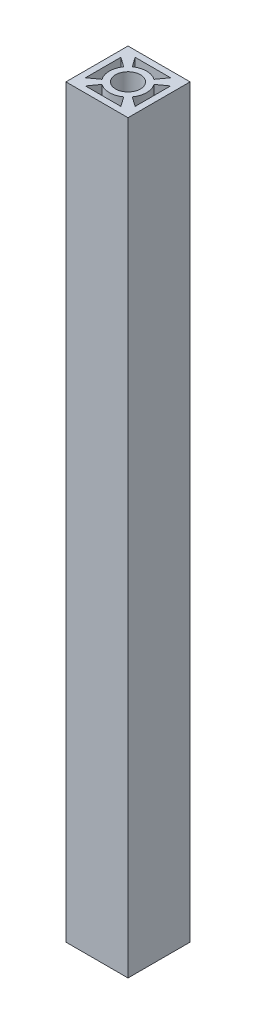
ISO-10303-21;
HEADER;
FILE_DESCRIPTION(('STEP AP214'),'2;1');
FILE_NAME('part.step','',(''),(''),'','','');
FILE_SCHEMA(('AUTOMOTIVE_DESIGN { 1 0 10303 214 1 1 1 1 }'));
ENDSEC;
DATA;
#1=APPLICATION_CONTEXT('core data for automotive mechanical design processes');
#2=APPLICATION_PROTOCOL_DEFINITION('international standard','automotive_design',2000,#1);
#3=PRODUCT_CONTEXT('',#1,'mechanical');
#4=PRODUCT('Part','Part','',(#3));
#5=PRODUCT_RELATED_PRODUCT_CATEGORY('part','',(#4));
#6=PRODUCT_DEFINITION_FORMATION('','',#4);
#7=PRODUCT_DEFINITION_CONTEXT('part definition',#1,'design');
#8=PRODUCT_DEFINITION('design','',#6,#7);
#9=PRODUCT_DEFINITION_SHAPE('','',#8);
#10=(LENGTH_UNIT() NAMED_UNIT(*) SI_UNIT(.MILLI.,.METRE.));
#11=(NAMED_UNIT(*) PLANE_ANGLE_UNIT() SI_UNIT($,.RADIAN.));
#12=(NAMED_UNIT(*) SI_UNIT($,.STERADIAN.) SOLID_ANGLE_UNIT());
#13=UNCERTAINTY_MEASURE_WITH_UNIT(LENGTH_MEASURE(1.E-05),#10,'distance_accuracy_value','');
#14=(GEOMETRIC_REPRESENTATION_CONTEXT(3) GLOBAL_UNCERTAINTY_ASSIGNED_CONTEXT((#13)) GLOBAL_UNIT_ASSIGNED_CONTEXT((#10,
#11,#12)) REPRESENTATION_CONTEXT('',''));
#15=CARTESIAN_POINT('',(0.,0.,0.));
#16=DIRECTION('',(0.,0.,1.));
#17=DIRECTION('',(1.,0.,0.));
#18=AXIS2_PLACEMENT_3D('',#15,#16,#17);
#19=CARTESIAN_POINT('',(49.9999999999999,600.,100.));
#20=DIRECTION('',(-1.,0.,0.));
#21=DIRECTION('',(0.,-1.,0.));
#22=AXIS2_PLACEMENT_3D('',#19,#20,#21);
#23=PLANE('',#22);
#24=DIRECTION('',(0.,1.,0.));
#25=VECTOR('',#24,1.);
#26=CARTESIAN_POINT('',(49.9999999999999,600.,0.));
#27=LINE('',#26,#25);
#28=CARTESIAN_POINT('',(50.0000000000001,-600.,0.));
#29=VERTEX_POINT('',#28);
#30=CARTESIAN_POINT('',(49.9999999999999,600.,0.));
#31=VERTEX_POINT('',#30);
#32=EDGE_CURVE('E303',#29,#31,#27,.T.);
#33=ORIENTED_EDGE('',*,*,#32,.T.);
#34=DIRECTION('',(0.,0.,-1.));
#35=VECTOR('',#34,1.);
#36=CARTESIAN_POINT('',(49.9999999999999,600.,100.));
#37=LINE('',#36,#35);
#38=CARTESIAN_POINT('',(49.9999999999999,600.,100.));
#39=VERTEX_POINT('',#38);
#40=EDGE_CURVE('E11',#39,#31,#37,.T.);
#41=ORIENTED_EDGE('',*,*,#40,.F.);
#42=DIRECTION('',(0.,1.,0.));
#43=VECTOR('',#42,1.);
#44=CARTESIAN_POINT('',(49.9999999999999,600.,100.));
#45=LINE('',#44,#43);
#46=CARTESIAN_POINT('',(50.0000000000001,-600.,100.));
#47=VERTEX_POINT('',#46);
#48=EDGE_CURVE('E310',#47,#39,#45,.T.);
#49=ORIENTED_EDGE('',*,*,#48,.F.);
#50=DIRECTION('',(0.,0.,-1.));
#51=VECTOR('',#50,1.);
#52=CARTESIAN_POINT('',(50.0000000000001,-600.,100.));
#53=LINE('',#52,#51);
#54=EDGE_CURVE('E320',#47,#29,#53,.T.);
#55=ORIENTED_EDGE('',*,*,#54,.T.);
#56=EDGE_LOOP('',(#33,#41,#49,#55));
#57=FACE_BOUND('',#56,.T.);
#58=ADVANCED_FACE('F35',(#57),#23,.F.);
#59=CARTESIAN_POINT('',(-50.0000000000001,600.,100.));
#60=DIRECTION('',(0.,-1.,0.));
#61=DIRECTION('',(0.,0.,-1.));
#62=AXIS2_PLACEMENT_3D('',#59,#60,#61);
#63=PLANE('',#62);
#64=DIRECTION('',(-0.58127467016539,0.,0.813707415367537));
#65=VECTOR('',#64,1.);
#66=CARTESIAN_POINT('',(-28.5741365600266,600.,89.9999999999997));
#67=LINE('',#66,#65);
#68=CARTESIAN_POINT('',(-17.438240104964,600.,74.4112224610246));
#69=VERTEX_POINT('',#68);
#70=CARTESIAN_POINT('',(-28.5741365600266,600.,89.9999999999997));
#71=VERTEX_POINT('',#70);
#72=EDGE_CURVE('E198',#69,#71,#67,.T.);
#73=ORIENTED_EDGE('',*,*,#72,.F.);
#74=CARTESIAN_POINT('',(0.,600.,50.));
#75=DIRECTION('',(0.,-1.,0.));
#76=DIRECTION('',(0.,0.,1.));
#77=AXIS2_PLACEMENT_3D('',#74,#75,#76);
#78=CIRCLE('',#77,29.9999999999984);
#79=CARTESIAN_POINT('',(17.438240104957,600.,74.4112224610255));
#80=VERTEX_POINT('',#79);
#81=EDGE_CURVE('E49',#80,#69,#78,.T.);
#82=ORIENTED_EDGE('',*,*,#81,.F.);
#83=DIRECTION('',(-0.581274670165418,0.,-0.813707415367517));
#84=VECTOR('',#83,1.);
#85=CARTESIAN_POINT('',(17.438240104957,600.,74.4112224610255));
#86=LINE('',#85,#84);
#87=CARTESIAN_POINT('',(28.5741365600201,600.,90.0000000000004));
#88=VERTEX_POINT('',#87);
#89=EDGE_CURVE('E189',#88,#80,#86,.T.);
#90=ORIENTED_EDGE('',*,*,#89,.F.);
#91=DIRECTION('',(1.,0.,0.));
#92=VECTOR('',#91,1.);
#93=CARTESIAN_POINT('',(28.5741365600201,600.,90.0000000000004));
#94=LINE('',#93,#92);
#95=EDGE_CURVE('E192',#71,#88,#94,.T.);
#96=ORIENTED_EDGE('',*,*,#95,.F.);
#97=EDGE_LOOP('',(#73,#82,#90,#96));
#98=FACE_BOUND('',#97,.T.);
#99=DIRECTION('',(0.813707415367539,0.,0.581274670165387));
#100=VECTOR('',#99,1.);
#101=CARTESIAN_POINT('',(39.9999999999998,600.,78.5741365600263));
#102=LINE('',#101,#100);
#103=CARTESIAN_POINT('',(24.4112224610245,600.,67.4382401049639));
#104=VERTEX_POINT('',#103);
#105=CARTESIAN_POINT('',(39.9999999999998,600.,78.5741365600263));
#106=VERTEX_POINT('',#105);
#107=EDGE_CURVE('E223',#104,#106,#102,.T.);
#108=ORIENTED_EDGE('',*,*,#107,.F.);
#109=CARTESIAN_POINT('',(0.,600.,50.));
#110=DIRECTION('',(0.,-1.,0.));
#111=DIRECTION('',(0.,0.,1.));
#112=AXIS2_PLACEMENT_3D('',#109,#110,#111);
#113=CIRCLE('',#112,29.9999999999984);
#114=CARTESIAN_POINT('',(24.4112224610254,600.,32.5617598950428));
#115=VERTEX_POINT('',#114);
#116=EDGE_CURVE('E204',#115,#104,#113,.T.);
#117=ORIENTED_EDGE('',*,*,#116,.F.);
#118=DIRECTION('',(-0.813707415367515,0.,0.581274670165421));
#119=VECTOR('',#118,1.);
#120=CARTESIAN_POINT('',(24.4112224610254,600.,32.5617598950428));
#121=LINE('',#120,#119);
#122=CARTESIAN_POINT('',(40.0000000000002,600.,21.4258634399797));
#123=VERTEX_POINT('',#122);
#124=EDGE_CURVE('E212',#123,#115,#121,.T.);
#125=ORIENTED_EDGE('',*,*,#124,.F.);
#126=DIRECTION('',(0.,0.,-1.));
#127=VECTOR('',#126,1.);
#128=CARTESIAN_POINT('',(40.0000000000002,600.,21.4258634399797));
#129=LINE('',#128,#127);
#130=EDGE_CURVE('E226',#106,#123,#129,.T.);
#131=ORIENTED_EDGE('',*,*,#130,.F.);
#132=EDGE_LOOP('',(#108,#117,#125,#131));
#133=FACE_BOUND('',#132,.T.);
#134=DIRECTION('',(0.581274670165385,0.,-0.813707415367541));
#135=VECTOR('',#134,1.);
#136=CARTESIAN_POINT('',(28.5741365600261,600.,10.0000000000001));
#137=LINE('',#136,#135);
#138=CARTESIAN_POINT('',(17.4382401049637,600.,25.5887775389753));
#139=VERTEX_POINT('',#138);
#140=CARTESIAN_POINT('',(28.5741365600261,600.,10.0000000000001));
#141=VERTEX_POINT('',#140);
#142=EDGE_CURVE('E255',#139,#141,#137,.T.);
#143=ORIENTED_EDGE('',*,*,#142,.F.);
#144=CARTESIAN_POINT('',(0.,600.,50.));
#145=DIRECTION('',(0.,-1.,0.));
#146=DIRECTION('',(0.,0.,1.));
#147=AXIS2_PLACEMENT_3D('',#144,#145,#146);
#148=CIRCLE('',#147,29.9999999999984);
#149=CARTESIAN_POINT('',(-17.4382401049573,600.,25.5887775389746));
#150=VERTEX_POINT('',#149);
#151=EDGE_CURVE('E233',#150,#139,#148,.T.);
#152=ORIENTED_EDGE('',*,*,#151,.F.);
#153=DIRECTION('',(0.581274670165424,0.,0.813707415367513));
#154=VECTOR('',#153,1.);
#155=CARTESIAN_POINT('',(-17.4382401049573,600.,25.5887775389746));
#156=LINE('',#155,#154);
#157=CARTESIAN_POINT('',(-28.5741365600205,600.,9.99999999999986));
#158=VERTEX_POINT('',#157);
#159=EDGE_CURVE('E244',#158,#150,#156,.T.);
#160=ORIENTED_EDGE('',*,*,#159,.F.);
#161=DIRECTION('',(-1.,0.,0.));
#162=VECTOR('',#161,1.);
#163=CARTESIAN_POINT('',(-28.5741365600205,600.,9.99999999999986));
#164=LINE('',#163,#162);
#165=EDGE_CURVE('E258',#141,#158,#164,.T.);
#166=ORIENTED_EDGE('',*,*,#165,.F.);
#167=EDGE_LOOP('',(#143,#152,#160,#166));
#168=FACE_BOUND('',#167,.T.);
#169=CARTESIAN_POINT('',(0.,600.,50.));
#170=DIRECTION('',(0.,1.,0.));
#171=DIRECTION('',(0.,0.,1.));
#172=AXIS2_PLACEMENT_3D('',#169,#170,#171);
#173=CIRCLE('',#172,20.);
#174=CARTESIAN_POINT('',(0.,600.,70.));
#175=VERTEX_POINT('',#174);
#176=EDGE_CURVE('E265',#175,#175,#173,.T.);
#177=ORIENTED_EDGE('',*,*,#176,.F.);
#178=EDGE_LOOP('',(#177));
#179=FACE_BOUND('',#178,.T.);
#180=DIRECTION('',(-0.813707415367543,0.,-0.581274670165382));
#181=VECTOR('',#180,1.);
#182=CARTESIAN_POINT('',(-40.0000000000001,600.,21.4258634399739));
#183=LINE('',#182,#181);
#184=CARTESIAN_POINT('',(-24.4112224610248,600.,32.5617598950363));
#185=VERTEX_POINT('',#184);
#186=CARTESIAN_POINT('',(-40.0000000000001,600.,21.4258634399739));
#187=VERTEX_POINT('',#186);
#188=EDGE_CURVE('E293',#185,#187,#183,.T.);
#189=ORIENTED_EDGE('',*,*,#188,.F.);
#190=CARTESIAN_POINT('',(0.,600.,50.));
#191=DIRECTION('',(0.,-1.,0.));
#192=DIRECTION('',(0.,0.,1.));
#193=AXIS2_PLACEMENT_3D('',#190,#191,#192);
#194=CIRCLE('',#193,29.9999999999984);
#195=CARTESIAN_POINT('',(-24.4112224610254,600.,67.4382401049573));
#196=VERTEX_POINT('',#195);
#197=EDGE_CURVE('E275',#196,#185,#194,.T.);
#198=ORIENTED_EDGE('',*,*,#197,.F.);
#199=DIRECTION('',(0.813707415367511,0.,-0.581274670165427));
#200=VECTOR('',#199,1.);
#201=CARTESIAN_POINT('',(-24.4112224610254,600.,67.4382401049573));
#202=LINE('',#201,#200);
#203=CARTESIAN_POINT('',(-40.0000000000001,600.,78.5741365600206));
#204=VERTEX_POINT('',#203);
#205=EDGE_CURVE('E282',#204,#196,#202,.T.);
#206=ORIENTED_EDGE('',*,*,#205,.F.);
#207=DIRECTION('',(0.,0.,1.));
#208=VECTOR('',#207,1.);
#209=CARTESIAN_POINT('',(-40.0000000000001,600.,78.5741365600206));
#210=LINE('',#209,#208);
#211=EDGE_CURVE('E296',#187,#204,#210,.T.);
#212=ORIENTED_EDGE('',*,*,#211,.F.);
#213=EDGE_LOOP('',(#189,#198,#206,#212));
#214=FACE_BOUND('',#213,.T.);
#215=DIRECTION('',(-1.,0.,0.));
#216=VECTOR('',#215,1.);
#217=CARTESIAN_POINT('',(-50.0000000000001,600.,0.));
#218=LINE('',#217,#216);
#219=CARTESIAN_POINT('',(-50.0000000000001,600.,0.));
#220=VERTEX_POINT('',#219);
#221=EDGE_CURVE('E323',#31,#220,#218,.T.);
#222=ORIENTED_EDGE('',*,*,#221,.T.);
#223=DIRECTION('',(0.,0.,-1.));
#224=VECTOR('',#223,1.);
#225=CARTESIAN_POINT('',(-50.0000000000001,600.,100.));
#226=LINE('',#225,#224);
#227=CARTESIAN_POINT('',(-50.0000000000001,600.,100.));
#228=VERTEX_POINT('',#227);
#229=EDGE_CURVE('E42',#228,#220,#226,.T.);
#230=ORIENTED_EDGE('',*,*,#229,.F.);
#231=DIRECTION('',(-1.,0.,0.));
#232=VECTOR('',#231,1.);
#233=CARTESIAN_POINT('',(-50.0000000000001,600.,100.));
#234=LINE('',#233,#232);
#235=EDGE_CURVE('E313',#39,#228,#234,.T.);
#236=ORIENTED_EDGE('',*,*,#235,.F.);
#237=ORIENTED_EDGE('',*,*,#40,.T.);
#238=EDGE_LOOP('',(#222,#230,#236,#237));
#239=FACE_BOUND('',#238,.T.);
#240=ADVANCED_FACE('F352',(#98,#133,#168,#179,#214,#239),#63,.F.);
#241=CARTESIAN_POINT('',(-50.0000000000001,600.,100.));
#242=DIRECTION('',(1.,0.,0.));
#243=DIRECTION('',(0.,1.,0.));
#244=AXIS2_PLACEMENT_3D('',#241,#242,#243);
#245=PLANE('',#244);
#246=DIRECTION('',(0.,-1.,0.));
#247=VECTOR('',#246,1.);
#248=CARTESIAN_POINT('',(-50.0000000000001,600.,0.));
#249=LINE('',#248,#247);
#250=CARTESIAN_POINT('',(-49.9999999999999,-600.,0.));
#251=VERTEX_POINT('',#250);
#252=EDGE_CURVE('E325',#220,#251,#249,.T.);
#253=ORIENTED_EDGE('',*,*,#252,.T.);
#254=DIRECTION('',(0.,0.,-1.));
#255=VECTOR('',#254,1.);
#256=CARTESIAN_POINT('',(-49.9999999999999,-600.,100.));
#257=LINE('',#256,#255);
#258=CARTESIAN_POINT('',(-49.9999999999999,-600.,100.));
#259=VERTEX_POINT('',#258);
#260=EDGE_CURVE('E330',#259,#251,#257,.T.);
#261=ORIENTED_EDGE('',*,*,#260,.F.);
#262=DIRECTION('',(0.,-1.,0.));
#263=VECTOR('',#262,1.);
#264=CARTESIAN_POINT('',(-50.0000000000001,600.,100.));
#265=LINE('',#264,#263);
#266=EDGE_CURVE('E316',#228,#259,#265,.T.);
#267=ORIENTED_EDGE('',*,*,#266,.F.);
#268=ORIENTED_EDGE('',*,*,#229,.T.);
#269=EDGE_LOOP('',(#253,#261,#267,#268));
#270=FACE_BOUND('',#269,.T.);
#271=ADVANCED_FACE('F337',(#270),#245,.F.);
#272=CARTESIAN_POINT('',(-49.9999999999999,-600.,100.));
#273=DIRECTION('',(0.,1.,0.));
#274=DIRECTION('',(0.,0.,1.));
#275=AXIS2_PLACEMENT_3D('',#272,#273,#274);
#276=PLANE('',#275);
#277=DIRECTION('',(-0.581274670165418,0.,-0.813707415367517));
#278=VECTOR('',#277,1.);
#279=CARTESIAN_POINT('',(17.438240104957,-600.,74.4112224610255));
#280=LINE('',#279,#278);
#281=CARTESIAN_POINT('',(28.5741365600201,-600.,90.0000000000004));
#282=VERTEX_POINT('',#281);
#283=CARTESIAN_POINT('',(17.438240104957,-600.,74.4112224610255));
#284=VERTEX_POINT('',#283);
#285=EDGE_CURVE('E179',#282,#284,#280,.T.);
#286=ORIENTED_EDGE('',*,*,#285,.T.);
#287=CARTESIAN_POINT('',(0.,-600.,50.));
#288=DIRECTION('',(0.,-1.,0.));
#289=DIRECTION('',(0.,0.,1.));
#290=AXIS2_PLACEMENT_3D('',#287,#288,#289);
#291=CIRCLE('',#290,29.9999999999984);
#292=CARTESIAN_POINT('',(-17.438240104964,-600.,74.4112224610246));
#293=VERTEX_POINT('',#292);
#294=EDGE_CURVE('E173',#284,#293,#291,.T.);
#295=ORIENTED_EDGE('',*,*,#294,.T.);
#296=DIRECTION('',(-0.58127467016539,0.,0.813707415367537));
#297=VECTOR('',#296,1.);
#298=CARTESIAN_POINT('',(-28.5741365600266,-600.,89.9999999999997));
#299=LINE('',#298,#297);
#300=CARTESIAN_POINT('',(-28.5741365600266,-600.,89.9999999999997));
#301=VERTEX_POINT('',#300);
#302=EDGE_CURVE('E182',#293,#301,#299,.T.);
#303=ORIENTED_EDGE('',*,*,#302,.T.);
#304=DIRECTION('',(1.,0.,0.));
#305=VECTOR('',#304,1.);
#306=CARTESIAN_POINT('',(28.5741365600201,-600.,90.0000000000004));
#307=LINE('',#306,#305);
#308=EDGE_CURVE('E57',#301,#282,#307,.T.);
#309=ORIENTED_EDGE('',*,*,#308,.T.);
#310=EDGE_LOOP('',(#286,#295,#303,#309));
#311=FACE_BOUND('',#310,.T.);
#312=DIRECTION('',(-0.813707415367515,0.,0.581274670165421));
#313=VECTOR('',#312,1.);
#314=CARTESIAN_POINT('',(24.4112224610254,-600.,32.5617598950428));
#315=LINE('',#314,#313);
#316=CARTESIAN_POINT('',(40.0000000000002,-600.,21.4258634399797));
#317=VERTEX_POINT('',#316);
#318=CARTESIAN_POINT('',(24.4112224610254,-600.,32.5617598950428));
#319=VERTEX_POINT('',#318);
#320=EDGE_CURVE('E218',#317,#319,#315,.T.);
#321=ORIENTED_EDGE('',*,*,#320,.T.);
#322=CARTESIAN_POINT('',(0.,-600.,50.));
#323=DIRECTION('',(0.,-1.,0.));
#324=DIRECTION('',(0.,0.,1.));
#325=AXIS2_PLACEMENT_3D('',#322,#323,#324);
#326=CIRCLE('',#325,29.9999999999984);
#327=CARTESIAN_POINT('',(24.4112224610245,-600.,67.4382401049639));
#328=VERTEX_POINT('',#327);
#329=EDGE_CURVE('E208',#319,#328,#326,.T.);
#330=ORIENTED_EDGE('',*,*,#329,.T.);
#331=DIRECTION('',(0.813707415367539,0.,0.581274670165387));
#332=VECTOR('',#331,1.);
#333=CARTESIAN_POINT('',(39.9999999999998,-600.,78.5741365600263));
#334=LINE('',#333,#332);
#335=CARTESIAN_POINT('',(39.9999999999998,-600.,78.5741365600263));
#336=VERTEX_POINT('',#335);
#337=EDGE_CURVE('E211',#328,#336,#334,.T.);
#338=ORIENTED_EDGE('',*,*,#337,.T.);
#339=DIRECTION('',(0.,0.,-1.));
#340=VECTOR('',#339,1.);
#341=CARTESIAN_POINT('',(40.0000000000002,-600.,21.4258634399797));
#342=LINE('',#341,#340);
#343=EDGE_CURVE('E215',#336,#317,#342,.T.);
#344=ORIENTED_EDGE('',*,*,#343,.T.);
#345=EDGE_LOOP('',(#321,#330,#338,#344));
#346=FACE_BOUND('',#345,.T.);
#347=DIRECTION('',(0.581274670165424,0.,0.813707415367513));
#348=VECTOR('',#347,1.);
#349=CARTESIAN_POINT('',(-17.4382401049573,-600.,25.5887775389746));
#350=LINE('',#349,#348);
#351=CARTESIAN_POINT('',(-28.5741365600205,-600.,9.99999999999986));
#352=VERTEX_POINT('',#351);
#353=CARTESIAN_POINT('',(-17.4382401049573,-600.,25.5887775389746));
#354=VERTEX_POINT('',#353);
#355=EDGE_CURVE('E250',#352,#354,#350,.T.);
#356=ORIENTED_EDGE('',*,*,#355,.T.);
#357=CARTESIAN_POINT('',(0.,-600.,50.));
#358=DIRECTION('',(0.,-1.,0.));
#359=DIRECTION('',(0.,0.,1.));
#360=AXIS2_PLACEMENT_3D('',#357,#358,#359);
#361=CIRCLE('',#360,29.9999999999984);
#362=CARTESIAN_POINT('',(17.4382401049637,-600.,25.5887775389753));
#363=VERTEX_POINT('',#362);
#364=EDGE_CURVE('E240',#354,#363,#361,.T.);
#365=ORIENTED_EDGE('',*,*,#364,.T.);
#366=DIRECTION('',(0.581274670165385,0.,-0.813707415367541));
#367=VECTOR('',#366,1.);
#368=CARTESIAN_POINT('',(28.5741365600261,-600.,10.0000000000001));
#369=LINE('',#368,#367);
#370=CARTESIAN_POINT('',(28.5741365600261,-600.,10.0000000000001));
#371=VERTEX_POINT('',#370);
#372=EDGE_CURVE('E243',#363,#371,#369,.T.);
#373=ORIENTED_EDGE('',*,*,#372,.T.);
#374=DIRECTION('',(-1.,0.,0.));
#375=VECTOR('',#374,1.);
#376=CARTESIAN_POINT('',(-28.5741365600205,-600.,9.99999999999986));
#377=LINE('',#376,#375);
#378=EDGE_CURVE('E247',#371,#352,#377,.T.);
#379=ORIENTED_EDGE('',*,*,#378,.T.);
#380=EDGE_LOOP('',(#356,#365,#373,#379));
#381=FACE_BOUND('',#380,.T.);
#382=CARTESIAN_POINT('',(0.,-600.,50.));
#383=DIRECTION('',(0.,1.,0.));
#384=DIRECTION('',(0.,0.,1.));
#385=AXIS2_PLACEMENT_3D('',#382,#383,#384);
#386=CIRCLE('',#385,20.);
#387=CARTESIAN_POINT('',(0.,-600.,70.));
#388=VERTEX_POINT('',#387);
#389=EDGE_CURVE('E272',#388,#388,#386,.T.);
#390=ORIENTED_EDGE('',*,*,#389,.T.);
#391=EDGE_LOOP('',(#390));
#392=FACE_BOUND('',#391,.T.);
#393=DIRECTION('',(0.813707415367511,0.,-0.581274670165427));
#394=VECTOR('',#393,1.);
#395=CARTESIAN_POINT('',(-24.4112224610254,-600.,67.4382401049573));
#396=LINE('',#395,#394);
#397=CARTESIAN_POINT('',(-40.0000000000001,-600.,78.5741365600206));
#398=VERTEX_POINT('',#397);
#399=CARTESIAN_POINT('',(-24.4112224610254,-600.,67.4382401049573));
#400=VERTEX_POINT('',#399);
#401=EDGE_CURVE('E288',#398,#400,#396,.T.);
#402=ORIENTED_EDGE('',*,*,#401,.T.);
#403=CARTESIAN_POINT('',(0.,-600.,50.));
#404=DIRECTION('',(0.,-1.,0.));
#405=DIRECTION('',(0.,0.,1.));
#406=AXIS2_PLACEMENT_3D('',#403,#404,#405);
#407=CIRCLE('',#406,29.9999999999984);
#408=CARTESIAN_POINT('',(-24.4112224610248,-600.,32.5617598950363));
#409=VERTEX_POINT('',#408);
#410=EDGE_CURVE('E278',#400,#409,#407,.T.);
#411=ORIENTED_EDGE('',*,*,#410,.T.);
#412=DIRECTION('',(-0.813707415367543,0.,-0.581274670165382));
#413=VECTOR('',#412,1.);
#414=CARTESIAN_POINT('',(-40.0000000000001,-600.,21.4258634399739));
#415=LINE('',#414,#413);
#416=CARTESIAN_POINT('',(-40.0000000000001,-600.,21.4258634399739));
#417=VERTEX_POINT('',#416);
#418=EDGE_CURVE('E281',#409,#417,#415,.T.);
#419=ORIENTED_EDGE('',*,*,#418,.T.);
#420=DIRECTION('',(0.,0.,1.));
#421=VECTOR('',#420,1.);
#422=CARTESIAN_POINT('',(-40.0000000000001,-600.,78.5741365600206));
#423=LINE('',#422,#421);
#424=EDGE_CURVE('E285',#417,#398,#423,.T.);
#425=ORIENTED_EDGE('',*,*,#424,.T.);
#426=EDGE_LOOP('',(#402,#411,#419,#425));
#427=FACE_BOUND('',#426,.T.);
#428=DIRECTION('',(1.,0.,0.));
#429=VECTOR('',#428,1.);
#430=CARTESIAN_POINT('',(-49.9999999999999,-600.,0.));
#431=LINE('',#430,#429);
#432=EDGE_CURVE('E314',#251,#29,#431,.T.);
#433=ORIENTED_EDGE('',*,*,#432,.T.);
#434=ORIENTED_EDGE('',*,*,#54,.F.);
#435=DIRECTION('',(1.,0.,0.));
#436=VECTOR('',#435,1.);
#437=CARTESIAN_POINT('',(-49.9999999999999,-600.,100.));
#438=LINE('',#437,#436);
#439=EDGE_CURVE('E318',#259,#47,#438,.T.);
#440=ORIENTED_EDGE('',*,*,#439,.F.);
#441=ORIENTED_EDGE('',*,*,#260,.T.);
#442=EDGE_LOOP('',(#433,#434,#440,#441));
#443=FACE_BOUND('',#442,.T.);
#444=ADVANCED_FACE('F186',(#311,#346,#381,#392,#427,#443),#276,.F.);
#445=CARTESIAN_POINT('',(0.,0.,100.));
#446=DIRECTION('',(0.,0.,1.));
#447=DIRECTION('',(1.,0.,0.));
#448=AXIS2_PLACEMENT_3D('',#445,#446,#447);
#449=PLANE('',#448);
#450=ORIENTED_EDGE('',*,*,#48,.T.);
#451=ORIENTED_EDGE('',*,*,#235,.T.);
#452=ORIENTED_EDGE('',*,*,#266,.T.);
#453=ORIENTED_EDGE('',*,*,#439,.T.);
#454=EDGE_LOOP('',(#450,#451,#452,#453));
#455=FACE_BOUND('',#454,.T.);
#456=ADVANCED_FACE('F351',(#455),#449,.T.);
#457=CARTESIAN_POINT('',(0.,0.,0.));
#458=DIRECTION('',(0.,0.,1.));
#459=DIRECTION('',(1.,0.,0.));
#460=AXIS2_PLACEMENT_3D('',#457,#458,#459);
#461=PLANE('',#460);
#462=ORIENTED_EDGE('',*,*,#32,.F.);
#463=ORIENTED_EDGE('',*,*,#432,.F.);
#464=ORIENTED_EDGE('',*,*,#252,.F.);
#465=ORIENTED_EDGE('',*,*,#221,.F.);
#466=EDGE_LOOP('',(#462,#463,#464,#465));
#467=FACE_BOUND('',#466,.T.);
#468=ADVANCED_FACE('F343',(#467),#461,.F.);
#469=CARTESIAN_POINT('',(0.,-600.,50.));
#470=DIRECTION('',(0.,1.,0.));
#471=DIRECTION('',(0.,0.,1.));
#472=AXIS2_PLACEMENT_3D('',#469,#470,#471);
#473=CYLINDRICAL_SURFACE('',#472,29.9999999999984);
#474=ORIENTED_EDGE('',*,*,#197,.T.);
#475=DIRECTION('',(0.,1.,0.));
#476=VECTOR('',#475,1.);
#477=CARTESIAN_POINT('',(-24.4112224610248,-600.,32.5617598950363));
#478=LINE('',#477,#476);
#479=EDGE_CURVE('E291',#409,#185,#478,.T.);
#480=ORIENTED_EDGE('',*,*,#479,.F.);
#481=ORIENTED_EDGE('',*,*,#410,.F.);
#482=DIRECTION('',(0.,1.,0.));
#483=VECTOR('',#482,1.);
#484=CARTESIAN_POINT('',(-24.4112224610254,-600.,67.4382401049573));
#485=LINE('',#484,#483);
#486=EDGE_CURVE('E301',#400,#196,#485,.T.);
#487=ORIENTED_EDGE('',*,*,#486,.T.);
#488=EDGE_LOOP('',(#474,#480,#481,#487));
#489=FACE_BOUND('',#488,.T.);
#490=ADVANCED_FACE('F366',(#489),#473,.T.);
#491=CARTESIAN_POINT('',(-24.4112224610254,-600.,67.4382401049573));
#492=DIRECTION('',(0.581274670165427,0.,0.813707415367511));
#493=DIRECTION('',(0.813707415367511,0.,-0.581274670165427));
#494=AXIS2_PLACEMENT_3D('',#491,#492,#493);
#495=PLANE('',#494);
#496=ORIENTED_EDGE('',*,*,#205,.T.);
#497=ORIENTED_EDGE('',*,*,#486,.F.);
#498=ORIENTED_EDGE('',*,*,#401,.F.);
#499=DIRECTION('',(0.,1.,0.));
#500=VECTOR('',#499,1.);
#501=CARTESIAN_POINT('',(-40.0000000000001,-600.,78.5741365600206));
#502=LINE('',#501,#500);
#503=EDGE_CURVE('E304',#398,#204,#502,.T.);
#504=ORIENTED_EDGE('',*,*,#503,.T.);
#505=EDGE_LOOP('',(#496,#497,#498,#504));
#506=FACE_BOUND('',#505,.T.);
#507=ADVANCED_FACE('F371',(#506),#495,.F.);
#508=CARTESIAN_POINT('',(-40.0000000000001,-600.,78.5741365600206));
#509=DIRECTION('',(-1.,0.,0.));
#510=DIRECTION('',(0.,0.,1.));
#511=AXIS2_PLACEMENT_3D('',#508,#509,#510);
#512=PLANE('',#511);
#513=ORIENTED_EDGE('',*,*,#211,.T.);
#514=ORIENTED_EDGE('',*,*,#503,.F.);
#515=ORIENTED_EDGE('',*,*,#424,.F.);
#516=DIRECTION('',(0.,1.,0.));
#517=VECTOR('',#516,1.);
#518=CARTESIAN_POINT('',(-40.0000000000001,-600.,21.4258634399739));
#519=LINE('',#518,#517);
#520=EDGE_CURVE('E306',#417,#187,#519,.T.);
#521=ORIENTED_EDGE('',*,*,#520,.T.);
#522=EDGE_LOOP('',(#513,#514,#515,#521));
#523=FACE_BOUND('',#522,.T.);
#524=ADVANCED_FACE('F377',(#523),#512,.F.);
#525=CARTESIAN_POINT('',(-40.0000000000001,-600.,21.4258634399739));
#526=DIRECTION('',(0.581274670165382,0.,-0.813707415367543));
#527=DIRECTION('',(-0.813707415367543,0.,-0.581274670165382));
#528=AXIS2_PLACEMENT_3D('',#525,#526,#527);
#529=PLANE('',#528);
#530=ORIENTED_EDGE('',*,*,#188,.T.);
#531=ORIENTED_EDGE('',*,*,#520,.F.);
#532=ORIENTED_EDGE('',*,*,#418,.F.);
#533=ORIENTED_EDGE('',*,*,#479,.T.);
#534=EDGE_LOOP('',(#530,#531,#532,#533));
#535=FACE_BOUND('',#534,.T.);
#536=ADVANCED_FACE('F373',(#535),#529,.F.);
#537=CARTESIAN_POINT('',(0.,-600.,50.));
#538=DIRECTION('',(0.,1.,0.));
#539=DIRECTION('',(0.,0.,1.));
#540=AXIS2_PLACEMENT_3D('',#537,#538,#539);
#541=CYLINDRICAL_SURFACE('',#540,20.);
#542=ORIENTED_EDGE('',*,*,#389,.F.);
#543=EDGE_LOOP('',(#542));
#544=FACE_BOUND('',#543,.T.);
#545=ORIENTED_EDGE('',*,*,#176,.T.);
#546=EDGE_LOOP('',(#545));
#547=FACE_BOUND('',#546,.T.);
#548=ADVANCED_FACE('F376',(#544,#547),#541,.F.);
#549=CARTESIAN_POINT('',(0.,-600.,50.));
#550=DIRECTION('',(0.,1.,0.));
#551=DIRECTION('',(0.,0.,1.));
#552=AXIS2_PLACEMENT_3D('',#549,#550,#551);
#553=CYLINDRICAL_SURFACE('',#552,29.9999999999984);
#554=ORIENTED_EDGE('',*,*,#151,.T.);
#555=DIRECTION('',(0.,1.,0.));
#556=VECTOR('',#555,1.);
#557=CARTESIAN_POINT('',(17.4382401049637,-600.,25.5887775389753));
#558=LINE('',#557,#556);
#559=EDGE_CURVE('E253',#363,#139,#558,.T.);
#560=ORIENTED_EDGE('',*,*,#559,.F.);
#561=ORIENTED_EDGE('',*,*,#364,.F.);
#562=DIRECTION('',(0.,1.,0.));
#563=VECTOR('',#562,1.);
#564=CARTESIAN_POINT('',(-17.4382401049573,-600.,25.5887775389746));
#565=LINE('',#564,#563);
#566=EDGE_CURVE('E263',#354,#150,#565,.T.);
#567=ORIENTED_EDGE('',*,*,#566,.T.);
#568=EDGE_LOOP('',(#554,#560,#561,#567));
#569=FACE_BOUND('',#568,.T.);
#570=ADVANCED_FACE('F387',(#569),#553,.T.);
#571=CARTESIAN_POINT('',(-17.4382401049573,-600.,25.5887775389746));
#572=DIRECTION('',(-0.813707415367513,0.,0.581274670165424));
#573=DIRECTION('',(0.581274670165424,0.,0.813707415367513));
#574=AXIS2_PLACEMENT_3D('',#571,#572,#573);
#575=PLANE('',#574);
#576=ORIENTED_EDGE('',*,*,#159,.T.);
#577=ORIENTED_EDGE('',*,*,#566,.F.);
#578=ORIENTED_EDGE('',*,*,#355,.F.);
#579=DIRECTION('',(0.,1.,0.));
#580=VECTOR('',#579,1.);
#581=CARTESIAN_POINT('',(-28.5741365600205,-600.,9.99999999999986));
#582=LINE('',#581,#580);
#583=EDGE_CURVE('E266',#352,#158,#582,.T.);
#584=ORIENTED_EDGE('',*,*,#583,.T.);
#585=EDGE_LOOP('',(#576,#577,#578,#584));
#586=FACE_BOUND('',#585,.T.);
#587=ADVANCED_FACE('F391',(#586),#575,.F.);
#588=CARTESIAN_POINT('',(-28.5741365600205,-600.,9.99999999999986));
#589=DIRECTION('',(0.,0.,-1.));
#590=DIRECTION('',(-1.,0.,0.));
#591=AXIS2_PLACEMENT_3D('',#588,#589,#590);
#592=PLANE('',#591);
#593=ORIENTED_EDGE('',*,*,#165,.T.);
#594=ORIENTED_EDGE('',*,*,#583,.F.);
#595=ORIENTED_EDGE('',*,*,#378,.F.);
#596=DIRECTION('',(0.,1.,0.));
#597=VECTOR('',#596,1.);
#598=CARTESIAN_POINT('',(28.5741365600261,-600.,10.0000000000001));
#599=LINE('',#598,#597);
#600=EDGE_CURVE('E268',#371,#141,#599,.T.);
#601=ORIENTED_EDGE('',*,*,#600,.T.);
#602=EDGE_LOOP('',(#593,#594,#595,#601));
#603=FACE_BOUND('',#602,.T.);
#604=ADVANCED_FACE('F397',(#603),#592,.F.);
#605=CARTESIAN_POINT('',(28.5741365600261,-600.,10.0000000000001));
#606=DIRECTION('',(0.813707415367541,0.,0.581274670165385));
#607=DIRECTION('',(0.581274670165385,0.,-0.813707415367541));
#608=AXIS2_PLACEMENT_3D('',#605,#606,#607);
#609=PLANE('',#608);
#610=ORIENTED_EDGE('',*,*,#142,.T.);
#611=ORIENTED_EDGE('',*,*,#600,.F.);
#612=ORIENTED_EDGE('',*,*,#372,.F.);
#613=ORIENTED_EDGE('',*,*,#559,.T.);
#614=EDGE_LOOP('',(#610,#611,#612,#613));
#615=FACE_BOUND('',#614,.T.);
#616=ADVANCED_FACE('F393',(#615),#609,.F.);
#617=CARTESIAN_POINT('',(0.,-600.,50.));
#618=DIRECTION('',(0.,1.,0.));
#619=DIRECTION('',(0.,0.,1.));
#620=AXIS2_PLACEMENT_3D('',#617,#618,#619);
#621=CYLINDRICAL_SURFACE('',#620,29.9999999999984);
#622=ORIENTED_EDGE('',*,*,#116,.T.);
#623=DIRECTION('',(0.,1.,0.));
#624=VECTOR('',#623,1.);
#625=CARTESIAN_POINT('',(24.4112224610245,-600.,67.4382401049639));
#626=LINE('',#625,#624);
#627=EDGE_CURVE('E221',#328,#104,#626,.T.);
#628=ORIENTED_EDGE('',*,*,#627,.F.);
#629=ORIENTED_EDGE('',*,*,#329,.F.);
#630=DIRECTION('',(0.,1.,0.));
#631=VECTOR('',#630,1.);
#632=CARTESIAN_POINT('',(24.4112224610254,-600.,32.5617598950428));
#633=LINE('',#632,#631);
#634=EDGE_CURVE('E231',#319,#115,#633,.T.);
#635=ORIENTED_EDGE('',*,*,#634,.T.);
#636=EDGE_LOOP('',(#622,#628,#629,#635));
#637=FACE_BOUND('',#636,.T.);
#638=ADVANCED_FACE('F396',(#637),#621,.T.);
#639=CARTESIAN_POINT('',(24.4112224610254,-600.,32.5617598950428));
#640=DIRECTION('',(-0.581274670165421,0.,-0.813707415367515));
#641=DIRECTION('',(-0.813707415367515,0.,0.581274670165421));
#642=AXIS2_PLACEMENT_3D('',#639,#640,#641);
#643=PLANE('',#642);
#644=ORIENTED_EDGE('',*,*,#124,.T.);
#645=ORIENTED_EDGE('',*,*,#634,.F.);
#646=ORIENTED_EDGE('',*,*,#320,.F.);
#647=DIRECTION('',(0.,1.,0.));
#648=VECTOR('',#647,1.);
#649=CARTESIAN_POINT('',(40.0000000000002,-600.,21.4258634399797));
#650=LINE('',#649,#648);
#651=EDGE_CURVE('E234',#317,#123,#650,.T.);
#652=ORIENTED_EDGE('',*,*,#651,.T.);
#653=EDGE_LOOP('',(#644,#645,#646,#652));
#654=FACE_BOUND('',#653,.T.);
#655=ADVANCED_FACE('F407',(#654),#643,.F.);
#656=CARTESIAN_POINT('',(40.0000000000002,-600.,21.4258634399797));
#657=DIRECTION('',(1.,0.,0.));
#658=DIRECTION('',(0.,0.,-1.));
#659=AXIS2_PLACEMENT_3D('',#656,#657,#658);
#660=PLANE('',#659);
#661=ORIENTED_EDGE('',*,*,#130,.T.);
#662=ORIENTED_EDGE('',*,*,#651,.F.);
#663=ORIENTED_EDGE('',*,*,#343,.F.);
#664=DIRECTION('',(0.,1.,0.));
#665=VECTOR('',#664,1.);
#666=CARTESIAN_POINT('',(39.9999999999998,-600.,78.5741365600263));
#667=LINE('',#666,#665);
#668=EDGE_CURVE('E236',#336,#106,#667,.T.);
#669=ORIENTED_EDGE('',*,*,#668,.T.);
#670=EDGE_LOOP('',(#661,#662,#663,#669));
#671=FACE_BOUND('',#670,.T.);
#672=ADVANCED_FACE('F412',(#671),#660,.F.);
#673=CARTESIAN_POINT('',(39.9999999999998,-600.,78.5741365600263));
#674=DIRECTION('',(-0.581274670165387,0.,0.813707415367539));
#675=DIRECTION('',(0.813707415367539,0.,0.581274670165387));
#676=AXIS2_PLACEMENT_3D('',#673,#674,#675);
#677=PLANE('',#676);
#678=ORIENTED_EDGE('',*,*,#107,.T.);
#679=ORIENTED_EDGE('',*,*,#668,.F.);
#680=ORIENTED_EDGE('',*,*,#337,.F.);
#681=ORIENTED_EDGE('',*,*,#627,.T.);
#682=EDGE_LOOP('',(#678,#679,#680,#681));
#683=FACE_BOUND('',#682,.T.);
#684=ADVANCED_FACE('F409',(#683),#677,.F.);
#685=CARTESIAN_POINT('',(0.,-600.,50.));
#686=DIRECTION('',(0.,1.,0.));
#687=DIRECTION('',(0.,0.,1.));
#688=AXIS2_PLACEMENT_3D('',#685,#686,#687);
#689=CYLINDRICAL_SURFACE('',#688,29.9999999999984);
#690=ORIENTED_EDGE('',*,*,#81,.T.);
#691=DIRECTION('',(0.,1.,0.));
#692=VECTOR('',#691,1.);
#693=CARTESIAN_POINT('',(-17.438240104964,-600.,74.4112224610246));
#694=LINE('',#693,#692);
#695=EDGE_CURVE('E169',#293,#69,#694,.T.);
#696=ORIENTED_EDGE('',*,*,#695,.F.);
#697=ORIENTED_EDGE('',*,*,#294,.F.);
#698=DIRECTION('',(0.,1.,0.));
#699=VECTOR('',#698,1.);
#700=CARTESIAN_POINT('',(17.438240104957,-600.,74.4112224610255));
#701=LINE('',#700,#699);
#702=EDGE_CURVE('E202',#284,#80,#701,.T.);
#703=ORIENTED_EDGE('',*,*,#702,.T.);
#704=EDGE_LOOP('',(#690,#696,#697,#703));
#705=FACE_BOUND('',#704,.T.);
#706=ADVANCED_FACE('F171',(#705),#689,.T.);
#707=CARTESIAN_POINT('',(17.438240104957,-600.,74.4112224610255));
#708=DIRECTION('',(0.813707415367517,0.,-0.581274670165418));
#709=DIRECTION('',(-0.581274670165418,0.,-0.813707415367517));
#710=AXIS2_PLACEMENT_3D('',#707,#708,#709);
#711=PLANE('',#710);
#712=ORIENTED_EDGE('',*,*,#89,.T.);
#713=ORIENTED_EDGE('',*,*,#702,.F.);
#714=ORIENTED_EDGE('',*,*,#285,.F.);
#715=DIRECTION('',(0.,1.,0.));
#716=VECTOR('',#715,1.);
#717=CARTESIAN_POINT('',(28.5741365600201,-600.,90.0000000000004));
#718=LINE('',#717,#716);
#719=EDGE_CURVE('E205',#282,#88,#718,.T.);
#720=ORIENTED_EDGE('',*,*,#719,.T.);
#721=EDGE_LOOP('',(#712,#713,#714,#720));
#722=FACE_BOUND('',#721,.T.);
#723=ADVANCED_FACE('F422',(#722),#711,.F.);
#724=CARTESIAN_POINT('',(28.5741365600201,-600.,90.0000000000004));
#725=DIRECTION('',(0.,0.,1.));
#726=DIRECTION('',(1.,0.,0.));
#727=AXIS2_PLACEMENT_3D('',#724,#725,#726);
#728=PLANE('',#727);
#729=ORIENTED_EDGE('',*,*,#95,.T.);
#730=ORIENTED_EDGE('',*,*,#719,.F.);
#731=ORIENTED_EDGE('',*,*,#308,.F.);
#732=DIRECTION('',(0.,1.,0.));
#733=VECTOR('',#732,1.);
#734=CARTESIAN_POINT('',(-28.5741365600266,-600.,89.9999999999997));
#735=LINE('',#734,#733);
#736=EDGE_CURVE('E178',#301,#71,#735,.T.);
#737=ORIENTED_EDGE('',*,*,#736,.T.);
#738=EDGE_LOOP('',(#729,#730,#731,#737));
#739=FACE_BOUND('',#738,.T.);
#740=ADVANCED_FACE('F425',(#739),#728,.F.);
#741=CARTESIAN_POINT('',(-28.5741365600266,-600.,89.9999999999997));
#742=DIRECTION('',(-0.813707415367537,0.,-0.58127467016539));
#743=DIRECTION('',(-0.58127467016539,0.,0.813707415367537));
#744=AXIS2_PLACEMENT_3D('',#741,#742,#743);
#745=PLANE('',#744);
#746=ORIENTED_EDGE('',*,*,#72,.T.);
#747=ORIENTED_EDGE('',*,*,#736,.F.);
#748=ORIENTED_EDGE('',*,*,#302,.F.);
#749=ORIENTED_EDGE('',*,*,#695,.T.);
#750=EDGE_LOOP('',(#746,#747,#748,#749));
#751=FACE_BOUND('',#750,.T.);
#752=ADVANCED_FACE('F183',(#751),#745,.F.);
#753=CLOSED_SHELL('',(#58,#240,#271,#444,#456,#468,#490,#507,#524,#536,#548,#570,#587,#604,#616,
#638,#655,#672,#684,#706,#723,#740,#752));
#754=MANIFOLD_SOLID_BREP('B2',#753);
#755=ADVANCED_BREP_SHAPE_REPRESENTATION('',(#18,#754),#14);
#756=SHAPE_DEFINITION_REPRESENTATION(#9,#755);
ENDSEC;
END-ISO-10303-21;
